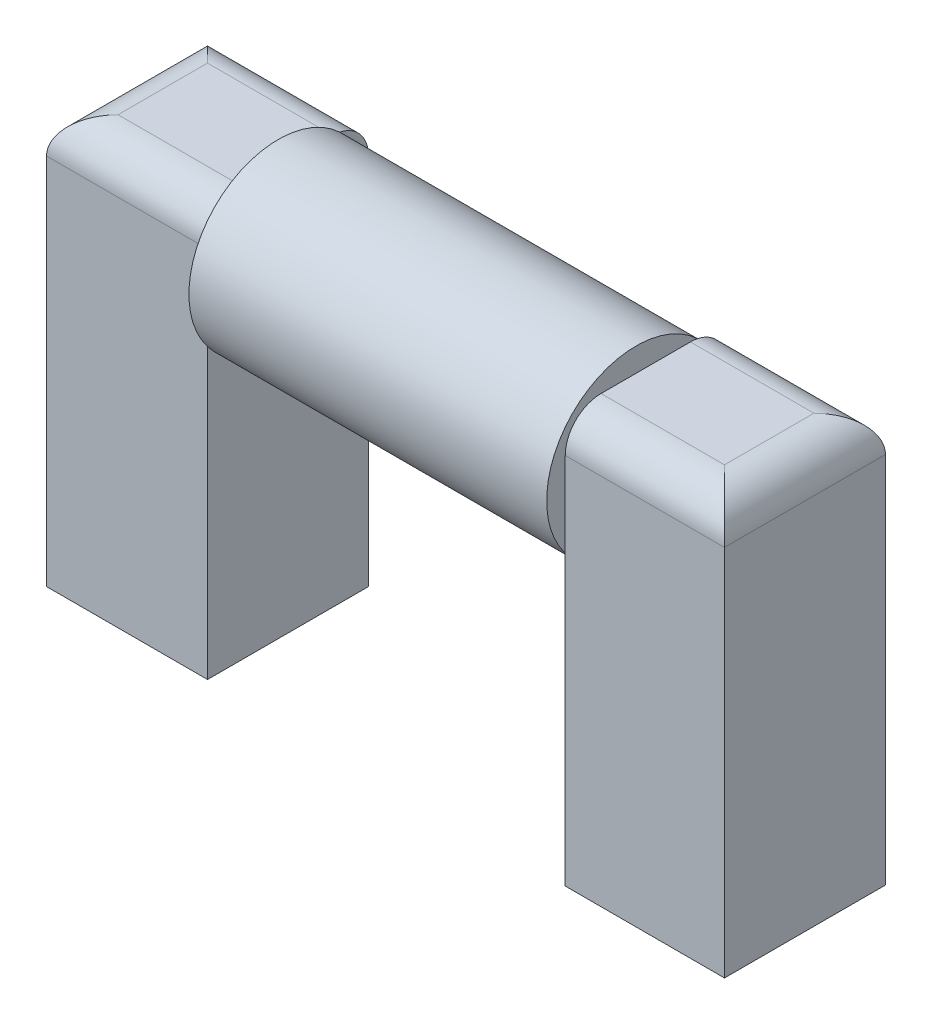
ISO-10303-21;
HEADER;
FILE_DESCRIPTION(('STEP AP214'),'2;1');
FILE_NAME('part.step','',(''),(''),'','','');
FILE_SCHEMA(('AUTOMOTIVE_DESIGN { 1 0 10303 214 1 1 1 1 }'));
ENDSEC;
DATA;
#1=APPLICATION_CONTEXT('core data for automotive mechanical design processes');
#2=APPLICATION_PROTOCOL_DEFINITION('international standard','automotive_design',2000,#1);
#3=PRODUCT_CONTEXT('',#1,'mechanical');
#4=PRODUCT('Part','Part','',(#3));
#5=PRODUCT_RELATED_PRODUCT_CATEGORY('part','',(#4));
#6=PRODUCT_DEFINITION_FORMATION('','',#4);
#7=PRODUCT_DEFINITION_CONTEXT('part definition',#1,'design');
#8=PRODUCT_DEFINITION('design','',#6,#7);
#9=PRODUCT_DEFINITION_SHAPE('','',#8);
#10=(LENGTH_UNIT() NAMED_UNIT(*) SI_UNIT(.MILLI.,.METRE.));
#11=(NAMED_UNIT(*) PLANE_ANGLE_UNIT() SI_UNIT($,.RADIAN.));
#12=(NAMED_UNIT(*) SI_UNIT($,.STERADIAN.) SOLID_ANGLE_UNIT());
#13=UNCERTAINTY_MEASURE_WITH_UNIT(LENGTH_MEASURE(1.E-05),#10,'distance_accuracy_value','');
#14=(GEOMETRIC_REPRESENTATION_CONTEXT(3) GLOBAL_UNCERTAINTY_ASSIGNED_CONTEXT((#13)) GLOBAL_UNIT_ASSIGNED_CONTEXT((#10,
#11,#12)) REPRESENTATION_CONTEXT('',''));
#15=CARTESIAN_POINT('',(0.,0.,0.));
#16=DIRECTION('',(0.,0.,1.));
#17=DIRECTION('',(1.,0.,0.));
#18=AXIS2_PLACEMENT_3D('',#15,#16,#17);
#19=CARTESIAN_POINT('',(0.,11.423295,4.5));
#20=DIRECTION('',(-1.,0.,0.));
#21=DIRECTION('',(0.,-1.,0.));
#22=AXIS2_PLACEMENT_3D('',#19,#20,#21);
#23=PLANE('',#22);
#24=DIRECTION('',(0.,1.,0.));
#25=VECTOR('',#24,1.);
#26=CARTESIAN_POINT('',(0.,11.423295,0.));
#27=LINE('',#26,#25);
#28=CARTESIAN_POINT('',(0.,0.,0.));
#29=VERTEX_POINT('',#28);
#30=CARTESIAN_POINT('',(0.,10.423295,0.));
#31=VERTEX_POINT('',#30);
#32=EDGE_CURVE('E137',#29,#31,#27,.T.);
#33=ORIENTED_EDGE('',*,*,#32,.T.);
#34=CARTESIAN_POINT('',(0.,10.423295,1.));
#35=DIRECTION('',(-1.,0.,0.));
#36=DIRECTION('',(0.,-1.,0.));
#37=AXIS2_PLACEMENT_3D('',#34,#35,#36);
#38=CIRCLE('',#37,1.);
#39=CARTESIAN_POINT('',(0.,11.4037871994358,0.803442001318821));
#40=VERTEX_POINT('',#39);
#41=EDGE_CURVE('E144',#31,#40,#38,.F.);
#42=ORIENTED_EDGE('',*,*,#41,.T.);
#43=CARTESIAN_POINT('',(0.,9.58654938642667,2.52031320527379));
#44=DIRECTION('',(1.,0.,0.));
#45=DIRECTION('',(0.,0.,-1.));
#46=AXIS2_PLACEMENT_3D('',#43,#44,#45);
#47=CIRCLE('',#46,2.5);
#48=CARTESIAN_POINT('',(0.,8.05984044403238,4.5));
#49=VERTEX_POINT('',#48);
#50=EDGE_CURVE('E214',#49,#40,#47,.T.);
#51=ORIENTED_EDGE('',*,*,#50,.F.);
#52=DIRECTION('',(0.,1.,0.));
#53=VECTOR('',#52,1.);
#54=CARTESIAN_POINT('',(0.,11.423295,4.5));
#55=LINE('',#54,#53);
#56=CARTESIAN_POINT('',(0.,0.,4.5));
#57=VERTEX_POINT('',#56);
#58=EDGE_CURVE('E230',#57,#49,#55,.T.);
#59=ORIENTED_EDGE('',*,*,#58,.F.);
#60=DIRECTION('',(0.,0.,-1.));
#61=VECTOR('',#60,1.);
#62=CARTESIAN_POINT('',(0.,0.,4.5));
#63=LINE('',#62,#61);
#64=EDGE_CURVE('E151',#57,#29,#63,.T.);
#65=ORIENTED_EDGE('',*,*,#64,.T.);
#66=EDGE_LOOP('',(#33,#42,#51,#59,#65));
#67=FACE_BOUND('',#66,.T.);
#68=ADVANCED_FACE('F39',(#67),#23,.F.);
#69=CARTESIAN_POINT('',(-4.5,11.423295,4.5));
#70=DIRECTION('',(0.,-1.,0.));
#71=DIRECTION('',(0.,0.,-1.));
#72=AXIS2_PLACEMENT_3D('',#69,#70,#71);
#73=PLANE('',#72);
#74=DIRECTION('',(0.,0.,-1.));
#75=VECTOR('',#74,1.);
#76=CARTESIAN_POINT('',(-3.5,11.423295,4.5));
#77=LINE('',#76,#75);
#78=CARTESIAN_POINT('',(-3.5,11.423295,1.));
#79=VERTEX_POINT('',#78);
#80=CARTESIAN_POINT('',(-3.5,11.423295,3.5));
#81=VERTEX_POINT('',#80);
#82=EDGE_CURVE('E187',#79,#81,#77,.F.);
#83=ORIENTED_EDGE('',*,*,#82,.T.);
#84=DIRECTION('',(-1.,0.,0.));
#85=VECTOR('',#84,1.);
#86=CARTESIAN_POINT('',(-4.5,11.423295,3.5));
#87=LINE('',#86,#85);
#88=CARTESIAN_POINT('',(0.,11.423295,3.5));
#89=VERTEX_POINT('',#88);
#90=EDGE_CURVE('E196',#81,#89,#87,.F.);
#91=ORIENTED_EDGE('',*,*,#90,.T.);
#92=DIRECTION('',(0.,0.,-1.));
#93=VECTOR('',#92,1.);
#94=CARTESIAN_POINT('',(0.,11.423295,4.5));
#95=LINE('',#94,#93);
#96=CARTESIAN_POINT('',(0.,11.423295,1.));
#97=VERTEX_POINT('',#96);
#98=EDGE_CURVE('E207',#89,#97,#95,.T.);
#99=ORIENTED_EDGE('',*,*,#98,.T.);
#100=DIRECTION('',(-1.,0.,0.));
#101=VECTOR('',#100,1.);
#102=CARTESIAN_POINT('',(-4.5,11.423295,1.));
#103=LINE('',#102,#101);
#104=EDGE_CURVE('E188',#97,#79,#103,.T.);
#105=ORIENTED_EDGE('',*,*,#104,.T.);
#106=EDGE_LOOP('',(#83,#91,#99,#105));
#107=FACE_BOUND('',#106,.T.);
#108=ADVANCED_FACE('F206',(#107),#73,.F.);
#109=CARTESIAN_POINT('',(-4.5,0.,4.5));
#110=DIRECTION('',(1.,0.,0.));
#111=DIRECTION('',(0.,1.,0.));
#112=AXIS2_PLACEMENT_3D('',#109,#110,#111);
#113=PLANE('',#112);
#114=DIRECTION('',(0.,-1.,0.));
#115=VECTOR('',#114,1.);
#116=CARTESIAN_POINT('',(-4.5,0.,4.5));
#117=LINE('',#116,#115);
#118=CARTESIAN_POINT('',(-4.5,10.423295,4.5));
#119=VERTEX_POINT('',#118);
#120=CARTESIAN_POINT('',(-4.5,0.,4.5));
#121=VERTEX_POINT('',#120);
#122=EDGE_CURVE('E221',#119,#121,#117,.T.);
#123=ORIENTED_EDGE('',*,*,#122,.F.);
#124=DIRECTION('',(0.,0.,-1.));
#125=VECTOR('',#124,1.);
#126=CARTESIAN_POINT('',(-4.5,10.423295,4.5));
#127=LINE('',#126,#125);
#128=CARTESIAN_POINT('',(-4.5,10.423295,0.));
#129=VERTEX_POINT('',#128);
#130=EDGE_CURVE('E127',#119,#129,#127,.T.);
#131=ORIENTED_EDGE('',*,*,#130,.T.);
#132=DIRECTION('',(0.,-1.,0.));
#133=VECTOR('',#132,1.);
#134=CARTESIAN_POINT('',(-4.5,0.,0.));
#135=LINE('',#134,#133);
#136=CARTESIAN_POINT('',(-4.5,0.,0.));
#137=VERTEX_POINT('',#136);
#138=EDGE_CURVE('E138',#129,#137,#135,.T.);
#139=ORIENTED_EDGE('',*,*,#138,.T.);
#140=DIRECTION('',(0.,0.,-1.));
#141=VECTOR('',#140,1.);
#142=CARTESIAN_POINT('',(-4.5,0.,4.5));
#143=LINE('',#142,#141);
#144=EDGE_CURVE('E215',#121,#137,#143,.T.);
#145=ORIENTED_EDGE('',*,*,#144,.F.);
#146=EDGE_LOOP('',(#123,#131,#139,#145));
#147=FACE_BOUND('',#146,.T.);
#148=ADVANCED_FACE('F225',(#147),#113,.F.);
#149=CARTESIAN_POINT('',(0.,0.,4.5));
#150=DIRECTION('',(0.,1.,0.));
#151=DIRECTION('',(-1.,0.,0.));
#152=AXIS2_PLACEMENT_3D('',#149,#150,#151);
#153=PLANE('',#152);
#154=DIRECTION('',(1.,0.,0.));
#155=VECTOR('',#154,1.);
#156=CARTESIAN_POINT('',(0.,0.,0.));
#157=LINE('',#156,#155);
#158=EDGE_CURVE('E240',#137,#29,#157,.T.);
#159=ORIENTED_EDGE('',*,*,#158,.T.);
#160=ORIENTED_EDGE('',*,*,#64,.F.);
#161=DIRECTION('',(1.,0.,0.));
#162=VECTOR('',#161,1.);
#163=CARTESIAN_POINT('',(0.,0.,4.5));
#164=LINE('',#163,#162);
#165=EDGE_CURVE('E229',#121,#57,#164,.T.);
#166=ORIENTED_EDGE('',*,*,#165,.F.);
#167=ORIENTED_EDGE('',*,*,#144,.T.);
#168=EDGE_LOOP('',(#159,#160,#166,#167));
#169=FACE_BOUND('',#168,.T.);
#170=ADVANCED_FACE('F347',(#169),#153,.F.);
#171=CARTESIAN_POINT('',(0.,0.,4.5));
#172=DIRECTION('',(0.,0.,-1.));
#173=DIRECTION('',(-1.,0.,0.));
#174=AXIS2_PLACEMENT_3D('',#171,#172,#173);
#175=PLANE('',#174);
#176=CARTESIAN_POINT('',(0.,10.423295,4.5));
#177=VERTEX_POINT('',#176);
#178=EDGE_CURVE('E224',#49,#177,#55,.T.);
#179=ORIENTED_EDGE('',*,*,#178,.T.);
#180=DIRECTION('',(-1.,0.,0.));
#181=VECTOR('',#180,1.);
#182=CARTESIAN_POINT('',(0.,10.423295,4.5));
#183=LINE('',#182,#181);
#184=EDGE_CURVE('E192',#177,#119,#183,.T.);
#185=ORIENTED_EDGE('',*,*,#184,.T.);
#186=ORIENTED_EDGE('',*,*,#122,.T.);
#187=ORIENTED_EDGE('',*,*,#165,.T.);
#188=ORIENTED_EDGE('',*,*,#58,.T.);
#189=EDGE_LOOP('',(#179,#185,#186,#187,#188));
#190=FACE_BOUND('',#189,.T.);
#191=ADVANCED_FACE('F220',(#190),#175,.F.);
#192=CARTESIAN_POINT('',(0.,0.,0.));
#193=DIRECTION('',(0.,0.,-1.));
#194=DIRECTION('',(-1.,0.,0.));
#195=AXIS2_PLACEMENT_3D('',#192,#193,#194);
#196=PLANE('',#195);
#197=ORIENTED_EDGE('',*,*,#138,.F.);
#198=DIRECTION('',(-1.,0.,0.));
#199=VECTOR('',#198,1.);
#200=CARTESIAN_POINT('',(0.,10.423295,0.));
#201=LINE('',#200,#199);
#202=EDGE_CURVE('E133',#129,#31,#201,.F.);
#203=ORIENTED_EDGE('',*,*,#202,.T.);
#204=ORIENTED_EDGE('',*,*,#32,.F.);
#205=ORIENTED_EDGE('',*,*,#158,.F.);
#206=EDGE_LOOP('',(#197,#203,#204,#205));
#207=FACE_BOUND('',#206,.T.);
#208=ADVANCED_FACE('F135',(#207),#196,.T.);
#209=CARTESIAN_POINT('',(0.,9.58654938642667,2.52031320527379));
#210=DIRECTION('',(1.,0.,0.));
#211=DIRECTION('',(0.,0.,-1.));
#212=AXIS2_PLACEMENT_3D('',#209,#210,#211);
#213=PLANE('',#212);
#214=ORIENTED_EDGE('',*,*,#98,.F.);
#215=CARTESIAN_POINT('',(0.,10.423295,3.5));
#216=DIRECTION('',(1.,0.,0.));
#217=DIRECTION('',(0.,0.,-1.));
#218=AXIS2_PLACEMENT_3D('',#215,#216,#217);
#219=CIRCLE('',#218,1.);
#220=EDGE_CURVE('E50',#89,#177,#219,.T.);
#221=ORIENTED_EDGE('',*,*,#220,.T.);
#222=ORIENTED_EDGE('',*,*,#178,.F.);
#223=EDGE_CURVE('E83',#40,#49,#47,.T.);
#224=ORIENTED_EDGE('',*,*,#223,.F.);
#225=CARTESIAN_POINT('',(0.,10.423295,1.));
#226=DIRECTION('',(1.,0.,0.));
#227=DIRECTION('',(0.,0.,-1.));
#228=AXIS2_PLACEMENT_3D('',#225,#226,#227);
#229=CIRCLE('',#228,1.);
#230=EDGE_CURVE('E11',#40,#97,#229,.T.);
#231=ORIENTED_EDGE('',*,*,#230,.T.);
#232=EDGE_LOOP('',(#214,#221,#222,#224,#231));
#233=FACE_BOUND('',#232,.T.);
#234=ADVANCED_FACE('F210',(#233),#213,.F.);
#235=CARTESIAN_POINT('',(10.,9.58654938642667,2.52031320527379));
#236=DIRECTION('',(-1.,0.,0.));
#237=DIRECTION('',(0.,0.,1.));
#238=AXIS2_PLACEMENT_3D('',#235,#236,#237);
#239=CYLINDRICAL_SURFACE('',#238,2.5);
#240=CARTESIAN_POINT('',(10.,9.58654938642667,2.52031320527379));
#241=DIRECTION('',(1.,0.,0.));
#242=DIRECTION('',(0.,0.,-1.));
#243=AXIS2_PLACEMENT_3D('',#240,#241,#242);
#244=CIRCLE('',#243,2.5);
#245=CARTESIAN_POINT('',(10.,11.4037871994358,0.803442001318821));
#246=VERTEX_POINT('',#245);
#247=CARTESIAN_POINT('',(10.,8.05984044403238,4.5));
#248=VERTEX_POINT('',#247);
#249=EDGE_CURVE('E58',#246,#248,#244,.T.);
#250=ORIENTED_EDGE('',*,*,#249,.F.);
#251=EDGE_CURVE('E340',#248,#246,#244,.T.);
#252=ORIENTED_EDGE('',*,*,#251,.F.);
#253=EDGE_LOOP('',(#250,#252));
#254=FACE_BOUND('',#253,.T.);
#255=ORIENTED_EDGE('',*,*,#223,.T.);
#256=ORIENTED_EDGE('',*,*,#50,.T.);
#257=EDGE_LOOP('',(#255,#256));
#258=FACE_BOUND('',#257,.T.);
#259=ADVANCED_FACE('F344',(#254,#258),#239,.T.);
#260=CARTESIAN_POINT('',(10.,9.58654938642667,2.52031320527379));
#261=DIRECTION('',(1.,0.,0.));
#262=DIRECTION('',(0.,0.,-1.));
#263=AXIS2_PLACEMENT_3D('',#260,#261,#262);
#264=PLANE('',#263);
#265=DIRECTION('',(0.,-1.,0.));
#266=VECTOR('',#265,1.);
#267=CARTESIAN_POINT('',(10.,11.423295,4.5));
#268=LINE('',#267,#266);
#269=CARTESIAN_POINT('',(10.,10.423295,4.5));
#270=VERTEX_POINT('',#269);
#271=EDGE_CURVE('E252',#270,#248,#268,.T.);
#272=ORIENTED_EDGE('',*,*,#271,.F.);
#273=CARTESIAN_POINT('',(10.,10.423295,3.5));
#274=DIRECTION('',(1.,0.,0.));
#275=DIRECTION('',(0.,0.,-1.));
#276=AXIS2_PLACEMENT_3D('',#273,#274,#275);
#277=CIRCLE('',#276,1.);
#278=CARTESIAN_POINT('',(10.,11.423295,3.5));
#279=VERTEX_POINT('',#278);
#280=EDGE_CURVE('E73',#270,#279,#277,.F.);
#281=ORIENTED_EDGE('',*,*,#280,.T.);
#282=DIRECTION('',(0.,0.,-1.));
#283=VECTOR('',#282,1.);
#284=CARTESIAN_POINT('',(10.,11.423295,4.5));
#285=LINE('',#284,#283);
#286=CARTESIAN_POINT('',(10.,11.423295,1.));
#287=VERTEX_POINT('',#286);
#288=EDGE_CURVE('E314',#279,#287,#285,.T.);
#289=ORIENTED_EDGE('',*,*,#288,.T.);
#290=CARTESIAN_POINT('',(10.,10.423295,1.));
#291=DIRECTION('',(1.,0.,0.));
#292=DIRECTION('',(0.,0.,-1.));
#293=AXIS2_PLACEMENT_3D('',#290,#291,#292);
#294=CIRCLE('',#293,1.);
#295=EDGE_CURVE('E159',#287,#246,#294,.F.);
#296=ORIENTED_EDGE('',*,*,#295,.T.);
#297=ORIENTED_EDGE('',*,*,#249,.T.);
#298=EDGE_LOOP('',(#272,#281,#289,#296,#297));
#299=FACE_BOUND('',#298,.T.);
#300=ADVANCED_FACE('F310',(#299),#264,.T.);
#301=CARTESIAN_POINT('',(10.,11.423295,4.5));
#302=DIRECTION('',(1.,0.,0.));
#303=DIRECTION('',(0.,0.,-1.));
#304=AXIS2_PLACEMENT_3D('',#301,#302,#303);
#305=PLANE('',#304);
#306=ORIENTED_EDGE('',*,*,#251,.T.);
#307=CARTESIAN_POINT('',(10.,10.423295,1.));
#308=DIRECTION('',(1.,0.,0.));
#309=DIRECTION('',(0.,0.,-1.));
#310=AXIS2_PLACEMENT_3D('',#307,#308,#309);
#311=CIRCLE('',#310,1.);
#312=CARTESIAN_POINT('',(10.,10.423295,0.));
#313=VERTEX_POINT('',#312);
#314=EDGE_CURVE('E264',#246,#313,#311,.F.);
#315=ORIENTED_EDGE('',*,*,#314,.T.);
#316=DIRECTION('',(0.,-1.,0.));
#317=VECTOR('',#316,1.);
#318=CARTESIAN_POINT('',(10.,11.423295,0.));
#319=LINE('',#318,#317);
#320=CARTESIAN_POINT('',(10.,0.,0.));
#321=VERTEX_POINT('',#320);
#322=EDGE_CURVE('E175',#313,#321,#319,.T.);
#323=ORIENTED_EDGE('',*,*,#322,.T.);
#324=DIRECTION('',(0.,0.,-1.));
#325=VECTOR('',#324,1.);
#326=CARTESIAN_POINT('',(10.,0.,4.5));
#327=LINE('',#326,#325);
#328=CARTESIAN_POINT('',(10.,0.,4.5));
#329=VERTEX_POINT('',#328);
#330=EDGE_CURVE('E335',#329,#321,#327,.T.);
#331=ORIENTED_EDGE('',*,*,#330,.F.);
#332=EDGE_CURVE('E289',#248,#329,#268,.T.);
#333=ORIENTED_EDGE('',*,*,#332,.F.);
#334=EDGE_LOOP('',(#306,#315,#323,#331,#333));
#335=FACE_BOUND('',#334,.T.);
#336=ADVANCED_FACE('F358',(#335),#305,.F.);
#337=CARTESIAN_POINT('',(10.,0.,4.5));
#338=DIRECTION('',(0.,1.,0.));
#339=DIRECTION('',(0.,0.,1.));
#340=AXIS2_PLACEMENT_3D('',#337,#338,#339);
#341=PLANE('',#340);
#342=DIRECTION('',(1.,0.,0.));
#343=VECTOR('',#342,1.);
#344=CARTESIAN_POINT('',(10.,0.,0.));
#345=LINE('',#344,#343);
#346=CARTESIAN_POINT('',(14.451373,0.,0.));
#347=VERTEX_POINT('',#346);
#348=EDGE_CURVE('E290',#321,#347,#345,.T.);
#349=ORIENTED_EDGE('',*,*,#348,.T.);
#350=DIRECTION('',(0.,0.,-1.));
#351=VECTOR('',#350,1.);
#352=CARTESIAN_POINT('',(14.451373,0.,4.5));
#353=LINE('',#352,#351);
#354=CARTESIAN_POINT('',(14.451373,0.,4.5));
#355=VERTEX_POINT('',#354);
#356=EDGE_CURVE('E287',#355,#347,#353,.T.);
#357=ORIENTED_EDGE('',*,*,#356,.F.);
#358=DIRECTION('',(1.,0.,0.));
#359=VECTOR('',#358,1.);
#360=CARTESIAN_POINT('',(10.,0.,4.5));
#361=LINE('',#360,#359);
#362=EDGE_CURVE('E320',#329,#355,#361,.T.);
#363=ORIENTED_EDGE('',*,*,#362,.F.);
#364=ORIENTED_EDGE('',*,*,#330,.T.);
#365=EDGE_LOOP('',(#349,#357,#363,#364));
#366=FACE_BOUND('',#365,.T.);
#367=ADVANCED_FACE('F360',(#366),#341,.F.);
#368=CARTESIAN_POINT('',(14.451373,0.,4.5));
#369=DIRECTION('',(-1.,0.,0.));
#370=DIRECTION('',(0.,0.,1.));
#371=AXIS2_PLACEMENT_3D('',#368,#369,#370);
#372=PLANE('',#371);
#373=DIRECTION('',(0.,1.,0.));
#374=VECTOR('',#373,1.);
#375=CARTESIAN_POINT('',(14.451373,0.,0.));
#376=LINE('',#375,#374);
#377=CARTESIAN_POINT('',(14.451373,10.423295,0.));
#378=VERTEX_POINT('',#377);
#379=EDGE_CURVE('E275',#347,#378,#376,.T.);
#380=ORIENTED_EDGE('',*,*,#379,.T.);
#381=DIRECTION('',(0.,0.,-1.));
#382=VECTOR('',#381,1.);
#383=CARTESIAN_POINT('',(14.451373,10.423295,4.5));
#384=LINE('',#383,#382);
#385=CARTESIAN_POINT('',(14.451373,10.423295,4.5));
#386=VERTEX_POINT('',#385);
#387=EDGE_CURVE('E261',#378,#386,#384,.F.);
#388=ORIENTED_EDGE('',*,*,#387,.T.);
#389=DIRECTION('',(0.,1.,0.));
#390=VECTOR('',#389,1.);
#391=CARTESIAN_POINT('',(14.451373,0.,4.5));
#392=LINE('',#391,#390);
#393=EDGE_CURVE('E308',#355,#386,#392,.T.);
#394=ORIENTED_EDGE('',*,*,#393,.F.);
#395=ORIENTED_EDGE('',*,*,#356,.T.);
#396=EDGE_LOOP('',(#380,#388,#394,#395));
#397=FACE_BOUND('',#396,.T.);
#398=ADVANCED_FACE('F282',(#397),#372,.F.);
#399=CARTESIAN_POINT('',(14.451373,11.423295,4.5));
#400=DIRECTION('',(0.,-1.,0.));
#401=DIRECTION('',(0.,0.,-1.));
#402=AXIS2_PLACEMENT_3D('',#399,#400,#401);
#403=PLANE('',#402);
#404=ORIENTED_EDGE('',*,*,#288,.F.);
#405=DIRECTION('',(-1.,0.,0.));
#406=VECTOR('',#405,1.);
#407=CARTESIAN_POINT('',(14.451373,11.423295,3.5));
#408=LINE('',#407,#406);
#409=CARTESIAN_POINT('',(13.451373,11.423295,3.5));
#410=VERTEX_POINT('',#409);
#411=EDGE_CURVE('E258',#279,#410,#408,.F.);
#412=ORIENTED_EDGE('',*,*,#411,.T.);
#413=DIRECTION('',(0.,0.,-1.));
#414=VECTOR('',#413,1.);
#415=CARTESIAN_POINT('',(13.451373,11.423295,4.5));
#416=LINE('',#415,#414);
#417=CARTESIAN_POINT('',(13.451373,11.423295,1.));
#418=VERTEX_POINT('',#417);
#419=EDGE_CURVE('E255',#410,#418,#416,.T.);
#420=ORIENTED_EDGE('',*,*,#419,.T.);
#421=DIRECTION('',(-1.,0.,0.));
#422=VECTOR('',#421,1.);
#423=CARTESIAN_POINT('',(14.451373,11.423295,1.));
#424=LINE('',#423,#422);
#425=EDGE_CURVE('E251',#418,#287,#424,.T.);
#426=ORIENTED_EDGE('',*,*,#425,.T.);
#427=EDGE_LOOP('',(#404,#412,#420,#426));
#428=FACE_BOUND('',#427,.T.);
#429=ADVANCED_FACE('F367',(#428),#403,.F.);
#430=CARTESIAN_POINT('',(0.,0.,4.5));
#431=DIRECTION('',(0.,0.,1.));
#432=DIRECTION('',(1.,0.,0.));
#433=AXIS2_PLACEMENT_3D('',#430,#431,#432);
#434=PLANE('',#433);
#435=ORIENTED_EDGE('',*,*,#393,.T.);
#436=DIRECTION('',(-1.,0.,0.));
#437=VECTOR('',#436,1.);
#438=CARTESIAN_POINT('',(10.,10.423295,4.5));
#439=LINE('',#438,#437);
#440=EDGE_CURVE('E248',#386,#270,#439,.T.);
#441=ORIENTED_EDGE('',*,*,#440,.T.);
#442=ORIENTED_EDGE('',*,*,#271,.T.);
#443=ORIENTED_EDGE('',*,*,#332,.T.);
#444=ORIENTED_EDGE('',*,*,#362,.T.);
#445=EDGE_LOOP('',(#435,#441,#442,#443,#444));
#446=FACE_BOUND('',#445,.T.);
#447=ADVANCED_FACE('F303',(#446),#434,.T.);
#448=CARTESIAN_POINT('',(0.,0.,0.));
#449=DIRECTION('',(0.,0.,1.));
#450=DIRECTION('',(1.,0.,0.));
#451=AXIS2_PLACEMENT_3D('',#448,#449,#450);
#452=PLANE('',#451);
#453=ORIENTED_EDGE('',*,*,#322,.F.);
#454=DIRECTION('',(-1.,0.,0.));
#455=VECTOR('',#454,1.);
#456=CARTESIAN_POINT('',(0.,10.423295,0.));
#457=LINE('',#456,#455);
#458=EDGE_CURVE('E198',#313,#378,#457,.F.);
#459=ORIENTED_EDGE('',*,*,#458,.T.);
#460=ORIENTED_EDGE('',*,*,#379,.F.);
#461=ORIENTED_EDGE('',*,*,#348,.F.);
#462=EDGE_LOOP('',(#453,#459,#460,#461));
#463=FACE_BOUND('',#462,.T.);
#464=ADVANCED_FACE('F272',(#463),#452,.F.);
#465=CARTESIAN_POINT('',(14.451373,10.423295,1.));
#466=DIRECTION('',(-1.,0.,0.));
#467=DIRECTION('',(0.,0.,1.));
#468=AXIS2_PLACEMENT_3D('',#465,#466,#467);
#469=CYLINDRICAL_SURFACE('',#468,1.);
#470=ORIENTED_EDGE('',*,*,#295,.F.);
#471=ORIENTED_EDGE('',*,*,#425,.F.);
#472=CARTESIAN_POINT('',(13.451373,10.423295,1.));
#473=DIRECTION('',(-0.707106781186547,0.,-0.707106781186547));
#474=DIRECTION('',(-0.707106781186547,0.,0.707106781186547));
#475=AXIS2_PLACEMENT_3D('',#472,#473,#474);
#476=ELLIPSE('',#475,1.41421356237309,1.);
#477=EDGE_CURVE('E172',#378,#418,#476,.F.);
#478=ORIENTED_EDGE('',*,*,#477,.F.);
#479=ORIENTED_EDGE('',*,*,#458,.F.);
#480=ORIENTED_EDGE('',*,*,#314,.F.);
#481=EDGE_LOOP('',(#470,#471,#478,#479,#480));
#482=FACE_BOUND('',#481,.T.);
#483=ADVANCED_FACE('F294',(#482),#469,.T.);
#484=CARTESIAN_POINT('',(13.451373,10.423295,4.5));
#485=DIRECTION('',(0.,0.,-1.));
#486=DIRECTION('',(-1.,0.,0.));
#487=AXIS2_PLACEMENT_3D('',#484,#485,#486);
#488=CYLINDRICAL_SURFACE('',#487,1.);
#489=ORIENTED_EDGE('',*,*,#477,.T.);
#490=ORIENTED_EDGE('',*,*,#419,.F.);
#491=CARTESIAN_POINT('',(13.451373,10.423295,3.5));
#492=DIRECTION('',(0.707106781186547,0.,-0.707106781186547));
#493=DIRECTION('',(-0.707106781186547,0.,-0.707106781186547));
#494=AXIS2_PLACEMENT_3D('',#491,#492,#493);
#495=ELLIPSE('',#494,1.41421356237309,1.);
#496=EDGE_CURVE('E168',#386,#410,#495,.F.);
#497=ORIENTED_EDGE('',*,*,#496,.F.);
#498=ORIENTED_EDGE('',*,*,#387,.F.);
#499=EDGE_LOOP('',(#489,#490,#497,#498));
#500=FACE_BOUND('',#499,.T.);
#501=ADVANCED_FACE('F298',(#500),#488,.T.);
#502=CARTESIAN_POINT('',(0.,10.423295,3.5));
#503=DIRECTION('',(1.,0.,0.));
#504=DIRECTION('',(0.,0.,-1.));
#505=AXIS2_PLACEMENT_3D('',#502,#503,#504);
#506=CYLINDRICAL_SURFACE('',#505,1.);
#507=ORIENTED_EDGE('',*,*,#496,.T.);
#508=ORIENTED_EDGE('',*,*,#411,.F.);
#509=ORIENTED_EDGE('',*,*,#280,.F.);
#510=ORIENTED_EDGE('',*,*,#440,.F.);
#511=EDGE_LOOP('',(#507,#508,#509,#510));
#512=FACE_BOUND('',#511,.T.);
#513=ADVANCED_FACE('F299',(#512),#506,.T.);
#514=CARTESIAN_POINT('',(-4.5,10.423295,1.));
#515=DIRECTION('',(1.,0.,0.));
#516=DIRECTION('',(0.,0.,-1.));
#517=AXIS2_PLACEMENT_3D('',#514,#515,#516);
#518=CYLINDRICAL_SURFACE('',#517,1.);
#519=ORIENTED_EDGE('',*,*,#41,.F.);
#520=ORIENTED_EDGE('',*,*,#202,.F.);
#521=CARTESIAN_POINT('',(-3.5,10.423295,1.));
#522=DIRECTION('',(0.707106781186547,0.,-0.707106781186547));
#523=DIRECTION('',(0.707106781186547,0.,0.707106781186547));
#524=AXIS2_PLACEMENT_3D('',#521,#522,#523);
#525=ELLIPSE('',#524,1.41421356237309,1.);
#526=EDGE_CURVE('E43',#79,#129,#525,.F.);
#527=ORIENTED_EDGE('',*,*,#526,.F.);
#528=ORIENTED_EDGE('',*,*,#104,.F.);
#529=ORIENTED_EDGE('',*,*,#230,.F.);
#530=EDGE_LOOP('',(#519,#520,#527,#528,#529));
#531=FACE_BOUND('',#530,.T.);
#532=ADVANCED_FACE('F41',(#531),#518,.T.);
#533=CARTESIAN_POINT('',(-3.5,10.423295,4.5));
#534=DIRECTION('',(0.,0.,-1.));
#535=DIRECTION('',(-1.,0.,0.));
#536=AXIS2_PLACEMENT_3D('',#533,#534,#535);
#537=CYLINDRICAL_SURFACE('',#536,1.);
#538=ORIENTED_EDGE('',*,*,#526,.T.);
#539=ORIENTED_EDGE('',*,*,#130,.F.);
#540=CARTESIAN_POINT('',(-3.5,10.423295,3.5));
#541=DIRECTION('',(-0.707106781186547,0.,-0.707106781186547));
#542=DIRECTION('',(0.707106781186547,0.,-0.707106781186547));
#543=AXIS2_PLACEMENT_3D('',#540,#541,#542);
#544=ELLIPSE('',#543,1.41421356237309,1.);
#545=EDGE_CURVE('E176',#81,#119,#544,.F.);
#546=ORIENTED_EDGE('',*,*,#545,.F.);
#547=ORIENTED_EDGE('',*,*,#82,.F.);
#548=EDGE_LOOP('',(#538,#539,#546,#547));
#549=FACE_BOUND('',#548,.T.);
#550=ADVANCED_FACE('F185',(#549),#537,.T.);
#551=CARTESIAN_POINT('',(0.,10.423295,3.5));
#552=DIRECTION('',(-1.,0.,0.));
#553=DIRECTION('',(0.,0.,1.));
#554=AXIS2_PLACEMENT_3D('',#551,#552,#553);
#555=CYLINDRICAL_SURFACE('',#554,1.);
#556=ORIENTED_EDGE('',*,*,#220,.F.);
#557=ORIENTED_EDGE('',*,*,#90,.F.);
#558=ORIENTED_EDGE('',*,*,#545,.T.);
#559=ORIENTED_EDGE('',*,*,#184,.F.);
#560=EDGE_LOOP('',(#556,#557,#558,#559));
#561=FACE_BOUND('',#560,.T.);
#562=ADVANCED_FACE('F217',(#561),#555,.T.);
#563=CLOSED_SHELL('',(#68,#108,#148,#170,#191,#208,#234,#259,#300,#336,#367,#398,#429,#447,#464,
#483,#501,#513,#532,#550,#562));
#564=MANIFOLD_SOLID_BREP('B2',#563);
#565=ADVANCED_BREP_SHAPE_REPRESENTATION('',(#18,#564),#14);
#566=SHAPE_DEFINITION_REPRESENTATION(#9,#565);
ENDSEC;
END-ISO-10303-21;
